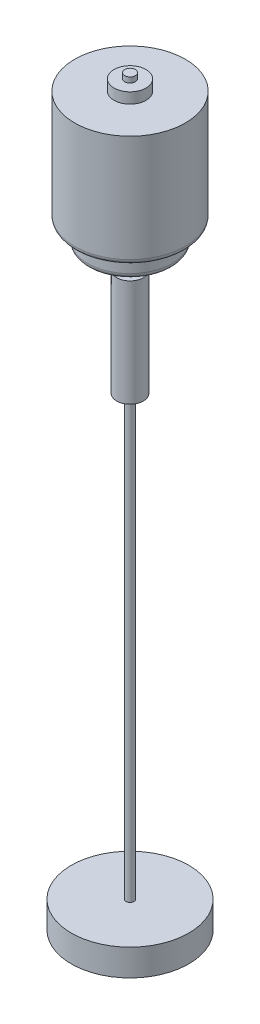
ISO-10303-21;
HEADER;
FILE_DESCRIPTION(('STEP AP214'),'2;1');
FILE_NAME('part.step','',(''),(''),'','','');
FILE_SCHEMA(('AUTOMOTIVE_DESIGN { 1 0 10303 214 1 1 1 1 }'));
ENDSEC;
DATA;
#1=APPLICATION_CONTEXT('core data for automotive mechanical design processes');
#2=APPLICATION_PROTOCOL_DEFINITION('international standard','automotive_design',2000,#1);
#3=PRODUCT_CONTEXT('',#1,'mechanical');
#4=PRODUCT('Part','Part','',(#3));
#5=PRODUCT_RELATED_PRODUCT_CATEGORY('part','',(#4));
#6=PRODUCT_DEFINITION_FORMATION('','',#4);
#7=PRODUCT_DEFINITION_CONTEXT('part definition',#1,'design');
#8=PRODUCT_DEFINITION('design','',#6,#7);
#9=PRODUCT_DEFINITION_SHAPE('','',#8);
#10=(LENGTH_UNIT() NAMED_UNIT(*) SI_UNIT(.MILLI.,.METRE.));
#11=(NAMED_UNIT(*) PLANE_ANGLE_UNIT() SI_UNIT($,.RADIAN.));
#12=(NAMED_UNIT(*) SI_UNIT($,.STERADIAN.) SOLID_ANGLE_UNIT());
#13=UNCERTAINTY_MEASURE_WITH_UNIT(LENGTH_MEASURE(1.E-05),#10,'distance_accuracy_value','');
#14=(GEOMETRIC_REPRESENTATION_CONTEXT(3) GLOBAL_UNCERTAINTY_ASSIGNED_CONTEXT((#13)) GLOBAL_UNIT_ASSIGNED_CONTEXT((#10,
#11,#12)) REPRESENTATION_CONTEXT('',''));
#15=CARTESIAN_POINT('',(0.,0.,0.));
#16=DIRECTION('',(0.,0.,1.));
#17=DIRECTION('',(1.,0.,0.));
#18=AXIS2_PLACEMENT_3D('',#15,#16,#17);
#19=CARTESIAN_POINT('',(3.,0.,0.));
#20=DIRECTION('',(0.,-1.,0.));
#21=DIRECTION('',(0.,0.,-1.));
#22=AXIS2_PLACEMENT_3D('',#19,#20,#21);
#23=PLANE('',#22);
#24=CARTESIAN_POINT('',(0.,0.,0.));
#25=DIRECTION('',(0.,-1.,0.));
#26=DIRECTION('',(0.,0.,-1.));
#27=AXIS2_PLACEMENT_3D('',#24,#25,#26);
#28=CIRCLE('',#27,1.);
#29=CARTESIAN_POINT('',(0.,0.,-1.));
#30=VERTEX_POINT('',#29);
#31=EDGE_CURVE('E82',#30,#30,#28,.T.);
#32=ORIENTED_EDGE('',*,*,#31,.F.);
#33=EDGE_LOOP('',(#32));
#34=FACE_BOUND('',#33,.T.);
#35=CARTESIAN_POINT('',(0.,0.,0.));
#36=DIRECTION('',(0.,-1.,0.));
#37=DIRECTION('',(0.,0.,-1.));
#38=AXIS2_PLACEMENT_3D('',#35,#36,#37);
#39=CIRCLE('',#38,3.);
#40=CARTESIAN_POINT('',(0.,0.,-3.));
#41=VERTEX_POINT('',#40);
#42=EDGE_CURVE('E70',#41,#41,#39,.T.);
#43=ORIENTED_EDGE('',*,*,#42,.T.);
#44=EDGE_LOOP('',(#43));
#45=FACE_BOUND('',#44,.T.);
#46=ADVANCED_FACE('F36',(#34,#45),#23,.T.);
#47=CARTESIAN_POINT('',(0.,26.5,0.));
#48=DIRECTION('',(0.,1.,0.));
#49=DIRECTION('',(0.,0.,1.));
#50=AXIS2_PLACEMENT_3D('',#47,#48,#49);
#51=PLANE('',#50);
#52=CARTESIAN_POINT('',(0.,26.5,0.));
#53=DIRECTION('',(0.,1.,0.));
#54=DIRECTION('',(0.,0.,1.));
#55=AXIS2_PLACEMENT_3D('',#52,#53,#54);
#56=CIRCLE('',#55,3.);
#57=CARTESIAN_POINT('',(0.,26.5,3.));
#58=VERTEX_POINT('',#57);
#59=EDGE_CURVE('E66',#58,#58,#56,.T.);
#60=ORIENTED_EDGE('',*,*,#59,.F.);
#61=EDGE_LOOP('',(#60));
#62=FACE_BOUND('',#61,.T.);
#63=CARTESIAN_POINT('',(0.,26.5,0.));
#64=DIRECTION('',(0.,-1.,0.));
#65=DIRECTION('',(0.,0.,-1.));
#66=AXIS2_PLACEMENT_3D('',#63,#64,#65);
#67=CIRCLE('',#66,10.35);
#68=CARTESIAN_POINT('',(0.,26.5,-10.35));
#69=VERTEX_POINT('',#68);
#70=EDGE_CURVE('E63',#69,#69,#67,.T.);
#71=ORIENTED_EDGE('',*,*,#70,.F.);
#72=EDGE_LOOP('',(#71));
#73=FACE_BOUND('',#72,.T.);
#74=ADVANCED_FACE('F131',(#62,#73),#51,.T.);
#75=CARTESIAN_POINT('',(0.,14.9514685669165,0.));
#76=DIRECTION('',(0.,-1.,0.));
#77=DIRECTION('',(0.,0.,-1.));
#78=AXIS2_PLACEMENT_3D('',#75,#76,#77);
#79=CYLINDRICAL_SURFACE('',#78,10.35);
#80=CARTESIAN_POINT('',(0.,6.5,0.));
#81=DIRECTION('',(0.,-1.,0.));
#82=DIRECTION('',(0.,0.,-1.));
#83=AXIS2_PLACEMENT_3D('',#80,#81,#82);
#84=CIRCLE('',#83,10.35);
#85=CARTESIAN_POINT('',(0.,6.5,-10.35));
#86=VERTEX_POINT('',#85);
#87=EDGE_CURVE('E10',#86,#86,#84,.F.);
#88=ORIENTED_EDGE('',*,*,#87,.T.);
#89=EDGE_LOOP('',(#88));
#90=FACE_BOUND('',#89,.T.);
#91=ORIENTED_EDGE('',*,*,#70,.T.);
#92=EDGE_LOOP('',(#91));
#93=FACE_BOUND('',#92,.T.);
#94=ADVANCED_FACE('F137',(#90,#93),#79,.T.);
#95=CARTESIAN_POINT('',(10.35,5.5,0.));
#96=DIRECTION('',(0.,-1.,0.));
#97=DIRECTION('',(0.,0.,-1.));
#98=AXIS2_PLACEMENT_3D('',#95,#96,#97);
#99=PLANE('',#98);
#100=CARTESIAN_POINT('',(0.,5.5,0.));
#101=DIRECTION('',(0.,-1.,0.));
#102=DIRECTION('',(0.,0.,-1.));
#103=AXIS2_PLACEMENT_3D('',#100,#101,#102);
#104=CIRCLE('',#103,8.9);
#105=CARTESIAN_POINT('',(0.,5.5,-8.9));
#106=VERTEX_POINT('',#105);
#107=EDGE_CURVE('E43',#106,#106,#104,.F.);
#108=ORIENTED_EDGE('',*,*,#107,.T.);
#109=EDGE_LOOP('',(#108));
#110=FACE_BOUND('',#109,.T.);
#111=CARTESIAN_POINT('',(0.,5.5,0.));
#112=DIRECTION('',(0.,-1.,0.));
#113=DIRECTION('',(0.,0.,-1.));
#114=AXIS2_PLACEMENT_3D('',#111,#112,#113);
#115=CIRCLE('',#114,9.35);
#116=CARTESIAN_POINT('',(0.,5.5,-9.35));
#117=VERTEX_POINT('',#116);
#118=EDGE_CURVE('E47',#117,#117,#115,.T.);
#119=ORIENTED_EDGE('',*,*,#118,.T.);
#120=EDGE_LOOP('',(#119));
#121=FACE_BOUND('',#120,.T.);
#122=ADVANCED_FACE('F155',(#110,#121),#99,.T.);
#123=CARTESIAN_POINT('',(0.,14.9514685669165,0.));
#124=DIRECTION('',(0.,-1.,0.));
#125=DIRECTION('',(0.,0.,-1.));
#126=AXIS2_PLACEMENT_3D('',#123,#124,#125);
#127=CYLINDRICAL_SURFACE('',#126,7.9);
#128=CARTESIAN_POINT('',(0.,2.5,0.));
#129=DIRECTION('',(0.,-1.,0.));
#130=DIRECTION('',(0.,0.,-1.));
#131=AXIS2_PLACEMENT_3D('',#128,#129,#130);
#132=CIRCLE('',#131,7.9);
#133=CARTESIAN_POINT('',(0.,2.5,-7.9));
#134=VERTEX_POINT('',#133);
#135=EDGE_CURVE('E51',#134,#134,#132,.F.);
#136=ORIENTED_EDGE('',*,*,#135,.T.);
#137=EDGE_LOOP('',(#136));
#138=FACE_BOUND('',#137,.T.);
#139=CARTESIAN_POINT('',(0.,4.5,0.));
#140=DIRECTION('',(0.,-1.,0.));
#141=DIRECTION('',(0.,0.,-1.));
#142=AXIS2_PLACEMENT_3D('',#139,#140,#141);
#143=CIRCLE('',#142,7.9);
#144=CARTESIAN_POINT('',(0.,4.5,-7.9));
#145=VERTEX_POINT('',#144);
#146=EDGE_CURVE('E56',#145,#145,#143,.T.);
#147=ORIENTED_EDGE('',*,*,#146,.T.);
#148=EDGE_LOOP('',(#147));
#149=FACE_BOUND('',#148,.T.);
#150=ADVANCED_FACE('F152',(#138,#149),#127,.T.);
#151=CARTESIAN_POINT('',(7.9,1.5,0.));
#152=DIRECTION('',(0.,-1.,0.));
#153=DIRECTION('',(0.,0.,-1.));
#154=AXIS2_PLACEMENT_3D('',#151,#152,#153);
#155=PLANE('',#154);
#156=CARTESIAN_POINT('',(0.,1.5,0.));
#157=DIRECTION('',(0.,-1.,0.));
#158=DIRECTION('',(0.,0.,-1.));
#159=AXIS2_PLACEMENT_3D('',#156,#157,#158);
#160=CIRCLE('',#159,6.9);
#161=CARTESIAN_POINT('',(0.,1.5,-6.9));
#162=VERTEX_POINT('',#161);
#163=EDGE_CURVE('E59',#162,#162,#160,.T.);
#164=ORIENTED_EDGE('',*,*,#163,.T.);
#165=EDGE_LOOP('',(#164));
#166=FACE_BOUND('',#165,.T.);
#167=CARTESIAN_POINT('',(0.,1.5,0.));
#168=DIRECTION('',(0.,-1.,0.));
#169=DIRECTION('',(0.,0.,-1.));
#170=AXIS2_PLACEMENT_3D('',#167,#168,#169);
#171=CIRCLE('',#170,3.);
#172=CARTESIAN_POINT('',(0.,1.5,-3.));
#173=VERTEX_POINT('',#172);
#174=EDGE_CURVE('E67',#173,#173,#171,.T.);
#175=ORIENTED_EDGE('',*,*,#174,.F.);
#176=EDGE_LOOP('',(#175));
#177=FACE_BOUND('',#176,.T.);
#178=ADVANCED_FACE('F154',(#166,#177),#155,.T.);
#179=CARTESIAN_POINT('',(0.,14.9514685669165,0.));
#180=DIRECTION('',(0.,-1.,0.));
#181=DIRECTION('',(0.,0.,-1.));
#182=AXIS2_PLACEMENT_3D('',#179,#180,#181);
#183=CYLINDRICAL_SURFACE('',#182,3.);
#184=ORIENTED_EDGE('',*,*,#174,.T.);
#185=EDGE_LOOP('',(#184));
#186=FACE_BOUND('',#185,.T.);
#187=ORIENTED_EDGE('',*,*,#42,.F.);
#188=EDGE_LOOP('',(#187));
#189=FACE_BOUND('',#188,.T.);
#190=ADVANCED_FACE('F162',(#186,#189),#183,.T.);
#191=CARTESIAN_POINT('',(0.,28.5,0.));
#192=DIRECTION('',(0.,-1.,0.));
#193=DIRECTION('',(0.,0.,-1.));
#194=AXIS2_PLACEMENT_3D('',#191,#192,#193);
#195=CYLINDRICAL_SURFACE('',#194,3.);
#196=CARTESIAN_POINT('',(0.,28.5,0.));
#197=DIRECTION('',(0.,1.,0.));
#198=DIRECTION('',(0.,0.,1.));
#199=AXIS2_PLACEMENT_3D('',#196,#197,#198);
#200=CIRCLE('',#199,3.);
#201=CARTESIAN_POINT('',(0.,28.5,3.));
#202=VERTEX_POINT('',#201);
#203=EDGE_CURVE('E73',#202,#202,#200,.T.);
#204=ORIENTED_EDGE('',*,*,#203,.F.);
#205=EDGE_LOOP('',(#204));
#206=FACE_BOUND('',#205,.T.);
#207=ORIENTED_EDGE('',*,*,#59,.T.);
#208=EDGE_LOOP('',(#207));
#209=FACE_BOUND('',#208,.T.);
#210=ADVANCED_FACE('F294',(#206,#209),#195,.T.);
#211=CARTESIAN_POINT('',(0.,28.5,0.));
#212=DIRECTION('',(0.,1.,0.));
#213=DIRECTION('',(0.,0.,1.));
#214=AXIS2_PLACEMENT_3D('',#211,#212,#213);
#215=PLANE('',#214);
#216=CARTESIAN_POINT('',(0.,28.5,0.));
#217=DIRECTION('',(0.,1.,0.));
#218=DIRECTION('',(0.,0.,1.));
#219=AXIS2_PLACEMENT_3D('',#216,#217,#218);
#220=CIRCLE('',#219,1.);
#221=CARTESIAN_POINT('',(0.,28.5,1.));
#222=VERTEX_POINT('',#221);
#223=EDGE_CURVE('E76',#222,#222,#220,.T.);
#224=ORIENTED_EDGE('',*,*,#223,.F.);
#225=EDGE_LOOP('',(#224));
#226=FACE_BOUND('',#225,.T.);
#227=ORIENTED_EDGE('',*,*,#203,.T.);
#228=EDGE_LOOP('',(#227));
#229=FACE_BOUND('',#228,.T.);
#230=ADVANCED_FACE('F285',(#226,#229),#215,.T.);
#231=CARTESIAN_POINT('',(0.,29.5,0.));
#232=DIRECTION('',(0.,-1.,0.));
#233=DIRECTION('',(0.,0.,-1.));
#234=AXIS2_PLACEMENT_3D('',#231,#232,#233);
#235=CYLINDRICAL_SURFACE('',#234,1.);
#236=CARTESIAN_POINT('',(0.,29.5,0.));
#237=DIRECTION('',(0.,1.,0.));
#238=DIRECTION('',(0.,0.,1.));
#239=AXIS2_PLACEMENT_3D('',#236,#237,#238);
#240=CIRCLE('',#239,1.);
#241=CARTESIAN_POINT('',(0.,29.5,1.));
#242=VERTEX_POINT('',#241);
#243=EDGE_CURVE('E79',#242,#242,#240,.T.);
#244=ORIENTED_EDGE('',*,*,#243,.F.);
#245=EDGE_LOOP('',(#244));
#246=FACE_BOUND('',#245,.T.);
#247=ORIENTED_EDGE('',*,*,#223,.T.);
#248=EDGE_LOOP('',(#247));
#249=FACE_BOUND('',#248,.T.);
#250=ADVANCED_FACE('F276',(#246,#249),#235,.T.);
#251=CARTESIAN_POINT('',(0.,29.5,0.));
#252=DIRECTION('',(0.,1.,0.));
#253=DIRECTION('',(0.,0.,1.));
#254=AXIS2_PLACEMENT_3D('',#251,#252,#253);
#255=PLANE('',#254);
#256=ORIENTED_EDGE('',*,*,#243,.T.);
#257=EDGE_LOOP('',(#256));
#258=FACE_BOUND('',#257,.T.);
#259=ADVANCED_FACE('F267',(#258),#255,.T.);
#260=CARTESIAN_POINT('',(0.,-2.5,0.));
#261=DIRECTION('',(0.,1.,0.));
#262=DIRECTION('',(0.,0.,1.));
#263=AXIS2_PLACEMENT_3D('',#260,#261,#262);
#264=CYLINDRICAL_SURFACE('',#263,1.);
#265=CARTESIAN_POINT('',(0.,-2.5,0.));
#266=DIRECTION('',(0.,-1.,0.));
#267=DIRECTION('',(0.,0.,-1.));
#268=AXIS2_PLACEMENT_3D('',#265,#266,#267);
#269=CIRCLE('',#268,1.);
#270=CARTESIAN_POINT('',(0.,-2.5,-1.));
#271=VERTEX_POINT('',#270);
#272=EDGE_CURVE('E85',#271,#271,#269,.T.);
#273=ORIENTED_EDGE('',*,*,#272,.F.);
#274=EDGE_LOOP('',(#273));
#275=FACE_BOUND('',#274,.T.);
#276=ORIENTED_EDGE('',*,*,#31,.T.);
#277=EDGE_LOOP('',(#276));
#278=FACE_BOUND('',#277,.T.);
#279=ADVANCED_FACE('F258',(#275,#278),#264,.T.);
#280=CARTESIAN_POINT('',(0.,-22.5,0.));
#281=DIRECTION('',(0.,1.,0.));
#282=DIRECTION('',(0.,0.,1.));
#283=AXIS2_PLACEMENT_3D('',#280,#281,#282);
#284=CYLINDRICAL_SURFACE('',#283,2.5);
#285=CARTESIAN_POINT('',(0.,-22.5,0.));
#286=DIRECTION('',(0.,-1.,0.));
#287=DIRECTION('',(0.,0.,-1.));
#288=AXIS2_PLACEMENT_3D('',#285,#286,#287);
#289=CIRCLE('',#288,2.5);
#290=CARTESIAN_POINT('',(0.,-22.5,-2.5));
#291=VERTEX_POINT('',#290);
#292=EDGE_CURVE('E90',#291,#291,#289,.T.);
#293=ORIENTED_EDGE('',*,*,#292,.F.);
#294=EDGE_LOOP('',(#293));
#295=FACE_BOUND('',#294,.T.);
#296=CARTESIAN_POINT('',(0.,-2.5,0.));
#297=DIRECTION('',(0.,-1.,0.));
#298=DIRECTION('',(0.,0.,-1.));
#299=AXIS2_PLACEMENT_3D('',#296,#297,#298);
#300=CIRCLE('',#299,2.5);
#301=CARTESIAN_POINT('',(0.,-2.5,-2.5));
#302=VERTEX_POINT('',#301);
#303=EDGE_CURVE('E91',#302,#302,#300,.T.);
#304=ORIENTED_EDGE('',*,*,#303,.T.);
#305=EDGE_LOOP('',(#304));
#306=FACE_BOUND('',#305,.T.);
#307=ADVANCED_FACE('F250',(#295,#306),#284,.T.);
#308=CARTESIAN_POINT('',(0.,-22.5,0.));
#309=DIRECTION('',(0.,-1.,0.));
#310=DIRECTION('',(0.,0.,-1.));
#311=AXIS2_PLACEMENT_3D('',#308,#309,#310);
#312=PLANE('',#311);
#313=CARTESIAN_POINT('',(0.,-22.5,0.));
#314=DIRECTION('',(0.,-1.,0.));
#315=DIRECTION('',(0.,0.,-1.));
#316=AXIS2_PLACEMENT_3D('',#313,#314,#315);
#317=CIRCLE('',#316,0.75);
#318=CARTESIAN_POINT('',(0.,-22.5,-0.75));
#319=VERTEX_POINT('',#318);
#320=EDGE_CURVE('E62',#319,#319,#317,.T.);
#321=ORIENTED_EDGE('',*,*,#320,.F.);
#322=EDGE_LOOP('',(#321));
#323=FACE_BOUND('',#322,.T.);
#324=ORIENTED_EDGE('',*,*,#292,.T.);
#325=EDGE_LOOP('',(#324));
#326=FACE_BOUND('',#325,.T.);
#327=ADVANCED_FACE('F241',(#323,#326),#312,.T.);
#328=CARTESIAN_POINT('',(0.,-2.5,0.));
#329=DIRECTION('',(0.,-1.,0.));
#330=DIRECTION('',(0.,0.,-1.));
#331=AXIS2_PLACEMENT_3D('',#328,#329,#330);
#332=PLANE('',#331);
#333=ORIENTED_EDGE('',*,*,#272,.T.);
#334=EDGE_LOOP('',(#333));
#335=FACE_BOUND('',#334,.T.);
#336=ORIENTED_EDGE('',*,*,#303,.F.);
#337=EDGE_LOOP('',(#336));
#338=FACE_BOUND('',#337,.T.);
#339=ADVANCED_FACE('F231',(#335,#338),#332,.F.);
#340=CARTESIAN_POINT('',(0.,-104.5,0.));
#341=DIRECTION('',(0.,1.,0.));
#342=DIRECTION('',(0.,0.,1.));
#343=AXIS2_PLACEMENT_3D('',#340,#341,#342);
#344=CYLINDRICAL_SURFACE('',#343,0.75);
#345=CARTESIAN_POINT('',(0.,-104.5,0.));
#346=DIRECTION('',(0.,-1.,0.));
#347=DIRECTION('',(0.,0.,-1.));
#348=AXIS2_PLACEMENT_3D('',#345,#346,#347);
#349=CIRCLE('',#348,0.75);
#350=CARTESIAN_POINT('',(0.,-104.5,-0.75));
#351=VERTEX_POINT('',#350);
#352=EDGE_CURVE('E94',#351,#351,#349,.T.);
#353=ORIENTED_EDGE('',*,*,#352,.F.);
#354=EDGE_LOOP('',(#353));
#355=FACE_BOUND('',#354,.T.);
#356=ORIENTED_EDGE('',*,*,#320,.T.);
#357=EDGE_LOOP('',(#356));
#358=FACE_BOUND('',#357,.T.);
#359=ADVANCED_FACE('F113',(#355,#358),#344,.T.);
#360=CARTESIAN_POINT('',(0.,-109.5,0.));
#361=DIRECTION('',(0.,1.,0.));
#362=DIRECTION('',(0.,0.,1.));
#363=AXIS2_PLACEMENT_3D('',#360,#361,#362);
#364=CYLINDRICAL_SURFACE('',#363,11.);
#365=CARTESIAN_POINT('',(0.,-109.5,0.));
#366=DIRECTION('',(0.,-1.,0.));
#367=DIRECTION('',(0.,0.,-1.));
#368=AXIS2_PLACEMENT_3D('',#365,#366,#367);
#369=CIRCLE('',#368,11.);
#370=CARTESIAN_POINT('',(0.,-109.5,-11.));
#371=VERTEX_POINT('',#370);
#372=EDGE_CURVE('E101',#371,#371,#369,.T.);
#373=ORIENTED_EDGE('',*,*,#372,.F.);
#374=EDGE_LOOP('',(#373));
#375=FACE_BOUND('',#374,.T.);
#376=CARTESIAN_POINT('',(0.,-104.5,0.));
#377=DIRECTION('',(0.,-1.,0.));
#378=DIRECTION('',(0.,0.,-1.));
#379=AXIS2_PLACEMENT_3D('',#376,#377,#378);
#380=CIRCLE('',#379,11.);
#381=CARTESIAN_POINT('',(0.,-104.5,-11.));
#382=VERTEX_POINT('',#381);
#383=EDGE_CURVE('E102',#382,#382,#380,.T.);
#384=ORIENTED_EDGE('',*,*,#383,.T.);
#385=EDGE_LOOP('',(#384));
#386=FACE_BOUND('',#385,.T.);
#387=ADVANCED_FACE('F110',(#375,#386),#364,.T.);
#388=CARTESIAN_POINT('',(0.,-109.5,0.));
#389=DIRECTION('',(0.,-1.,0.));
#390=DIRECTION('',(0.,0.,-1.));
#391=AXIS2_PLACEMENT_3D('',#388,#389,#390);
#392=PLANE('',#391);
#393=ORIENTED_EDGE('',*,*,#372,.T.);
#394=EDGE_LOOP('',(#393));
#395=FACE_BOUND('',#394,.T.);
#396=ADVANCED_FACE('F108',(#395),#392,.T.);
#397=CARTESIAN_POINT('',(0.,-104.5,0.));
#398=DIRECTION('',(0.,-1.,0.));
#399=DIRECTION('',(0.,0.,-1.));
#400=AXIS2_PLACEMENT_3D('',#397,#398,#399);
#401=PLANE('',#400);
#402=ORIENTED_EDGE('',*,*,#352,.T.);
#403=EDGE_LOOP('',(#402));
#404=FACE_BOUND('',#403,.T.);
#405=ORIENTED_EDGE('',*,*,#383,.F.);
#406=EDGE_LOOP('',(#405));
#407=FACE_BOUND('',#406,.T.);
#408=ADVANCED_FACE('F117',(#404,#407),#401,.F.);
#409=CARTESIAN_POINT('',(0.,2.5,0.));
#410=DIRECTION('',(0.,-1.,0.));
#411=DIRECTION('',(0.,0.,-1.));
#412=AXIS2_PLACEMENT_3D('',#409,#410,#411);
#413=TOROIDAL_SURFACE('',#412,6.9,1.);
#414=ORIENTED_EDGE('',*,*,#135,.F.);
#415=EDGE_LOOP('',(#414));
#416=FACE_BOUND('',#415,.T.);
#417=ORIENTED_EDGE('',*,*,#163,.F.);
#418=EDGE_LOOP('',(#417));
#419=FACE_BOUND('',#418,.T.);
#420=ADVANCED_FACE('F119',(#416,#419),#413,.T.);
#421=CARTESIAN_POINT('',(0.,4.5,0.));
#422=DIRECTION('',(0.,-1.,0.));
#423=DIRECTION('',(0.,0.,-1.));
#424=AXIS2_PLACEMENT_3D('',#421,#422,#423);
#425=TOROIDAL_SURFACE('',#424,8.9,1.);
#426=ORIENTED_EDGE('',*,*,#107,.F.);
#427=EDGE_LOOP('',(#426));
#428=FACE_BOUND('',#427,.T.);
#429=ORIENTED_EDGE('',*,*,#146,.F.);
#430=EDGE_LOOP('',(#429));
#431=FACE_BOUND('',#430,.T.);
#432=ADVANCED_FACE('F126',(#428,#431),#425,.F.);
#433=CARTESIAN_POINT('',(0.,6.5,0.));
#434=DIRECTION('',(0.,-1.,0.));
#435=DIRECTION('',(0.,0.,-1.));
#436=AXIS2_PLACEMENT_3D('',#433,#434,#435);
#437=TOROIDAL_SURFACE('',#436,9.35,1.);
#438=ORIENTED_EDGE('',*,*,#87,.F.);
#439=EDGE_LOOP('',(#438));
#440=FACE_BOUND('',#439,.T.);
#441=ORIENTED_EDGE('',*,*,#118,.F.);
#442=EDGE_LOOP('',(#441));
#443=FACE_BOUND('',#442,.T.);
#444=ADVANCED_FACE('F38',(#440,#443),#437,.T.);
#445=CLOSED_SHELL('',(#46,#74,#94,#122,#150,#178,#190,#210,#230,#250,#259,#279,#307,#327,#339,
#359,#387,#396,#408,#420,#432,#444));
#446=MANIFOLD_SOLID_BREP('B2',#445);
#447=ADVANCED_BREP_SHAPE_REPRESENTATION('',(#18,#446),#14);
#448=SHAPE_DEFINITION_REPRESENTATION(#9,#447);
ENDSEC;
END-ISO-10303-21;
